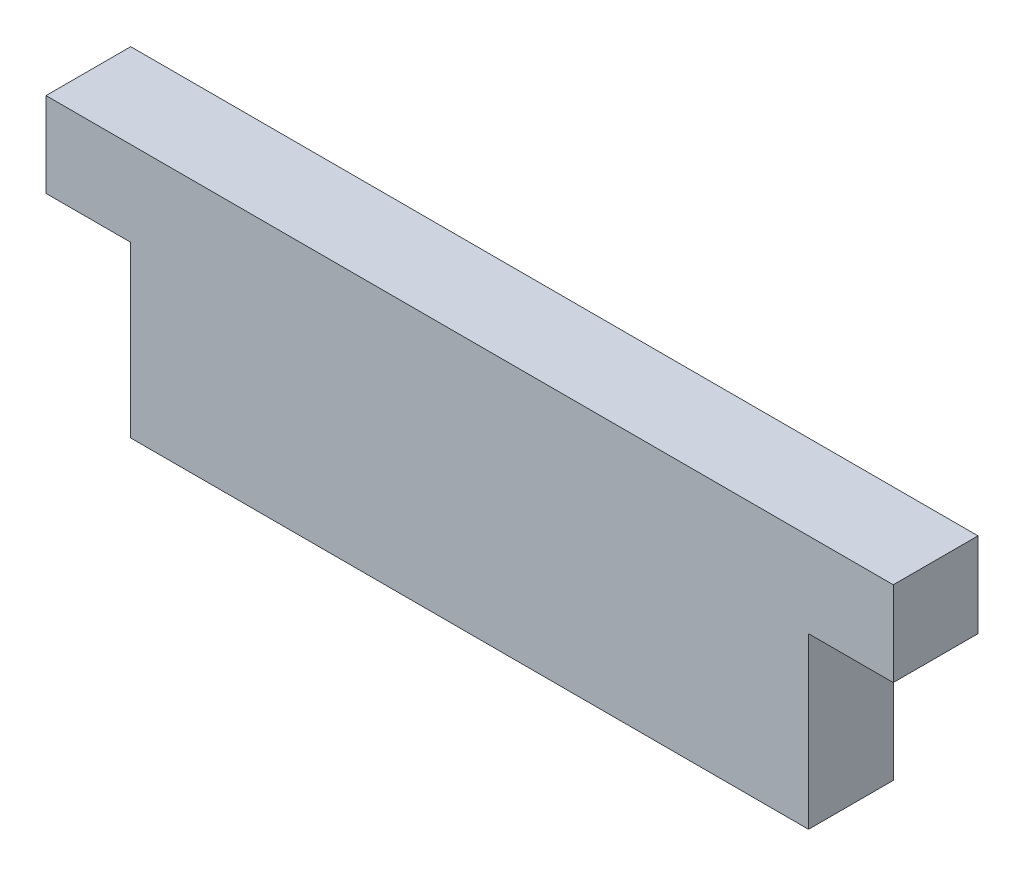
ISO-10303-21;
HEADER;
FILE_DESCRIPTION(('STEP AP214'),'2;1');
FILE_NAME('part.step','',(''),(''),'','','');
FILE_SCHEMA(('AUTOMOTIVE_DESIGN { 1 0 10303 214 1 1 1 1 }'));
ENDSEC;
DATA;
#1=APPLICATION_CONTEXT('core data for automotive mechanical design processes');
#2=APPLICATION_PROTOCOL_DEFINITION('international standard','automotive_design',2000,#1);
#3=PRODUCT_CONTEXT('',#1,'mechanical');
#4=PRODUCT('Part','Part','',(#3));
#5=PRODUCT_RELATED_PRODUCT_CATEGORY('part','',(#4));
#6=PRODUCT_DEFINITION_FORMATION('','',#4);
#7=PRODUCT_DEFINITION_CONTEXT('part definition',#1,'design');
#8=PRODUCT_DEFINITION('design','',#6,#7);
#9=PRODUCT_DEFINITION_SHAPE('','',#8);
#10=(LENGTH_UNIT() NAMED_UNIT(*) SI_UNIT(.MILLI.,.METRE.));
#11=(NAMED_UNIT(*) PLANE_ANGLE_UNIT() SI_UNIT($,.RADIAN.));
#12=(NAMED_UNIT(*) SI_UNIT($,.STERADIAN.) SOLID_ANGLE_UNIT());
#13=UNCERTAINTY_MEASURE_WITH_UNIT(LENGTH_MEASURE(1.E-05),#10,'distance_accuracy_value','');
#14=(GEOMETRIC_REPRESENTATION_CONTEXT(3) GLOBAL_UNCERTAINTY_ASSIGNED_CONTEXT((#13)) GLOBAL_UNIT_ASSIGNED_CONTEXT((#10,
#11,#12)) REPRESENTATION_CONTEXT('',''));
#15=CARTESIAN_POINT('',(0.,0.,0.));
#16=DIRECTION('',(0.,0.,1.));
#17=DIRECTION('',(1.,0.,0.));
#18=AXIS2_PLACEMENT_3D('',#15,#16,#17);
#19=CARTESIAN_POINT('',(0.,0.,5.));
#20=DIRECTION('',(1.,0.,0.));
#21=DIRECTION('',(0.,1.,0.));
#22=AXIS2_PLACEMENT_3D('',#19,#20,#21);
#23=PLANE('',#22);
#24=DIRECTION('',(0.,-1.,0.));
#25=VECTOR('',#24,1.);
#26=CARTESIAN_POINT('',(0.,0.,0.));
#27=LINE('',#26,#25);
#28=CARTESIAN_POINT('',(0.,0.,0.));
#29=VERTEX_POINT('',#28);
#30=CARTESIAN_POINT('',(0.,-10.,0.));
#31=VERTEX_POINT('',#30);
#32=EDGE_CURVE('E128',#29,#31,#27,.T.);
#33=ORIENTED_EDGE('',*,*,#32,.F.);
#34=DIRECTION('',(0.,0.,-1.));
#35=VECTOR('',#34,1.);
#36=CARTESIAN_POINT('',(0.,0.,5.));
#37=LINE('',#36,#35);
#38=CARTESIAN_POINT('',(0.,0.,5.));
#39=VERTEX_POINT('',#38);
#40=EDGE_CURVE('E11',#39,#29,#37,.T.);
#41=ORIENTED_EDGE('',*,*,#40,.F.);
#42=DIRECTION('',(0.,-1.,0.));
#43=VECTOR('',#42,1.);
#44=CARTESIAN_POINT('',(0.,0.,5.));
#45=LINE('',#44,#43);
#46=CARTESIAN_POINT('',(0.,-10.,5.));
#47=VERTEX_POINT('',#46);
#48=EDGE_CURVE('E146',#39,#47,#45,.T.);
#49=ORIENTED_EDGE('',*,*,#48,.T.);
#50=DIRECTION('',(0.,0.,-1.));
#51=VECTOR('',#50,1.);
#52=CARTESIAN_POINT('',(0.,-10.,5.));
#53=LINE('',#52,#51);
#54=EDGE_CURVE('E48',#47,#31,#53,.T.);
#55=ORIENTED_EDGE('',*,*,#54,.T.);
#56=EDGE_LOOP('',(#33,#41,#49,#55));
#57=FACE_BOUND('',#56,.T.);
#58=ADVANCED_FACE('F32',(#57),#23,.T.);
#59=CARTESIAN_POINT('',(0.,0.,5.));
#60=DIRECTION('',(0.,1.,0.));
#61=DIRECTION('',(0.,0.,1.));
#62=AXIS2_PLACEMENT_3D('',#59,#60,#61);
#63=PLANE('',#62);
#64=DIRECTION('',(1.,0.,0.));
#65=VECTOR('',#64,1.);
#66=CARTESIAN_POINT('',(0.,0.,0.));
#67=LINE('',#66,#65);
#68=CARTESIAN_POINT('',(5.,0.,0.));
#69=VERTEX_POINT('',#68);
#70=EDGE_CURVE('E130',#29,#69,#67,.T.);
#71=ORIENTED_EDGE('',*,*,#70,.T.);
#72=DIRECTION('',(0.,0.,-1.));
#73=VECTOR('',#72,1.);
#74=CARTESIAN_POINT('',(5.,0.,5.));
#75=LINE('',#74,#73);
#76=CARTESIAN_POINT('',(5.,0.,5.));
#77=VERTEX_POINT('',#76);
#78=EDGE_CURVE('E40',#77,#69,#75,.T.);
#79=ORIENTED_EDGE('',*,*,#78,.F.);
#80=DIRECTION('',(1.,0.,0.));
#81=VECTOR('',#80,1.);
#82=CARTESIAN_POINT('',(0.,0.,5.));
#83=LINE('',#82,#81);
#84=EDGE_CURVE('E111',#39,#77,#83,.T.);
#85=ORIENTED_EDGE('',*,*,#84,.F.);
#86=ORIENTED_EDGE('',*,*,#40,.T.);
#87=EDGE_LOOP('',(#71,#79,#85,#86));
#88=FACE_BOUND('',#87,.T.);
#89=ADVANCED_FACE('F184',(#88),#63,.F.);
#90=CARTESIAN_POINT('',(5.,0.,5.));
#91=DIRECTION('',(-1.,0.,0.));
#92=DIRECTION('',(0.,-1.,0.));
#93=AXIS2_PLACEMENT_3D('',#90,#91,#92);
#94=PLANE('',#93);
#95=DIRECTION('',(0.,1.,0.));
#96=VECTOR('',#95,1.);
#97=CARTESIAN_POINT('',(5.,0.,0.));
#98=LINE('',#97,#96);
#99=CARTESIAN_POINT('',(5.,4.99999999999999,0.));
#100=VERTEX_POINT('',#99);
#101=EDGE_CURVE('E132',#69,#100,#98,.T.);
#102=ORIENTED_EDGE('',*,*,#101,.T.);
#103=DIRECTION('',(0.,0.,-1.));
#104=VECTOR('',#103,1.);
#105=CARTESIAN_POINT('',(5.,4.99999999999999,5.));
#106=LINE('',#105,#104);
#107=CARTESIAN_POINT('',(5.,4.99999999999999,5.));
#108=VERTEX_POINT('',#107);
#109=EDGE_CURVE('E152',#108,#100,#106,.T.);
#110=ORIENTED_EDGE('',*,*,#109,.F.);
#111=DIRECTION('',(0.,1.,0.));
#112=VECTOR('',#111,1.);
#113=CARTESIAN_POINT('',(5.,0.,5.));
#114=LINE('',#113,#112);
#115=EDGE_CURVE('E160',#77,#108,#114,.T.);
#116=ORIENTED_EDGE('',*,*,#115,.F.);
#117=ORIENTED_EDGE('',*,*,#78,.T.);
#118=EDGE_LOOP('',(#102,#110,#116,#117));
#119=FACE_BOUND('',#118,.T.);
#120=ADVANCED_FACE('F158',(#119),#94,.F.);
#121=CARTESIAN_POINT('',(0.,4.99999999999999,5.));
#122=DIRECTION('',(0.,1.,0.));
#123=DIRECTION('',(0.,0.,1.));
#124=AXIS2_PLACEMENT_3D('',#121,#122,#123);
#125=PLANE('',#124);
#126=DIRECTION('',(1.,0.,0.));
#127=VECTOR('',#126,1.);
#128=CARTESIAN_POINT('',(0.,4.99999999999999,0.));
#129=LINE('',#128,#127);
#130=CARTESIAN_POINT('',(-45.,4.99999999999999,0.));
#131=VERTEX_POINT('',#130);
#132=EDGE_CURVE('E135',#131,#100,#129,.T.);
#133=ORIENTED_EDGE('',*,*,#132,.F.);
#134=DIRECTION('',(0.,0.,-1.));
#135=VECTOR('',#134,1.);
#136=CARTESIAN_POINT('',(-45.,4.99999999999999,5.));
#137=LINE('',#136,#135);
#138=CARTESIAN_POINT('',(-45.,4.99999999999999,5.));
#139=VERTEX_POINT('',#138);
#140=EDGE_CURVE('E150',#139,#131,#137,.T.);
#141=ORIENTED_EDGE('',*,*,#140,.F.);
#142=DIRECTION('',(1.,0.,0.));
#143=VECTOR('',#142,1.);
#144=CARTESIAN_POINT('',(0.,4.99999999999999,5.));
#145=LINE('',#144,#143);
#146=EDGE_CURVE('E170',#139,#108,#145,.T.);
#147=ORIENTED_EDGE('',*,*,#146,.T.);
#148=ORIENTED_EDGE('',*,*,#109,.T.);
#149=EDGE_LOOP('',(#133,#141,#147,#148));
#150=FACE_BOUND('',#149,.T.);
#151=ADVANCED_FACE('F168',(#150),#125,.T.);
#152=CARTESIAN_POINT('',(-45.,0.,5.));
#153=DIRECTION('',(-1.,0.,0.));
#154=DIRECTION('',(0.,0.,1.));
#155=AXIS2_PLACEMENT_3D('',#152,#153,#154);
#156=PLANE('',#155);
#157=DIRECTION('',(0.,1.,0.));
#158=VECTOR('',#157,1.);
#159=CARTESIAN_POINT('',(-45.,0.,0.));
#160=LINE('',#159,#158);
#161=CARTESIAN_POINT('',(-45.,0.,0.));
#162=VERTEX_POINT('',#161);
#163=EDGE_CURVE('E138',#162,#131,#160,.T.);
#164=ORIENTED_EDGE('',*,*,#163,.F.);
#165=DIRECTION('',(0.,0.,-1.));
#166=VECTOR('',#165,1.);
#167=CARTESIAN_POINT('',(-45.,0.,5.));
#168=LINE('',#167,#166);
#169=CARTESIAN_POINT('',(-45.,0.,5.));
#170=VERTEX_POINT('',#169);
#171=EDGE_CURVE('E119',#170,#162,#168,.T.);
#172=ORIENTED_EDGE('',*,*,#171,.F.);
#173=DIRECTION('',(0.,1.,0.));
#174=VECTOR('',#173,1.);
#175=CARTESIAN_POINT('',(-45.,0.,5.));
#176=LINE('',#175,#174);
#177=EDGE_CURVE('E108',#170,#139,#176,.T.);
#178=ORIENTED_EDGE('',*,*,#177,.T.);
#179=ORIENTED_EDGE('',*,*,#140,.T.);
#180=EDGE_LOOP('',(#164,#172,#178,#179));
#181=FACE_BOUND('',#180,.T.);
#182=ADVANCED_FACE('F194',(#181),#156,.T.);
#183=CARTESIAN_POINT('',(-40.,0.,0.));
#184=VERTEX_POINT('',#183);
#185=EDGE_CURVE('E116',#162,#184,#67,.T.);
#186=ORIENTED_EDGE('',*,*,#185,.T.);
#187=DIRECTION('',(0.,0.,-1.));
#188=VECTOR('',#187,1.);
#189=CARTESIAN_POINT('',(-40.,0.,5.));
#190=LINE('',#189,#188);
#191=CARTESIAN_POINT('',(-40.,0.,5.));
#192=VERTEX_POINT('',#191);
#193=EDGE_CURVE('E113',#192,#184,#190,.T.);
#194=ORIENTED_EDGE('',*,*,#193,.F.);
#195=EDGE_CURVE('E99',#170,#192,#83,.T.);
#196=ORIENTED_EDGE('',*,*,#195,.F.);
#197=ORIENTED_EDGE('',*,*,#171,.T.);
#198=EDGE_LOOP('',(#186,#194,#196,#197));
#199=FACE_BOUND('',#198,.T.);
#200=ADVANCED_FACE('F114',(#199),#63,.F.);
#201=CARTESIAN_POINT('',(-40.,0.,5.));
#202=DIRECTION('',(1.,0.,0.));
#203=DIRECTION('',(0.,0.,-1.));
#204=AXIS2_PLACEMENT_3D('',#201,#202,#203);
#205=PLANE('',#204);
#206=DIRECTION('',(0.,-1.,0.));
#207=VECTOR('',#206,1.);
#208=CARTESIAN_POINT('',(-40.,0.,0.));
#209=LINE('',#208,#207);
#210=CARTESIAN_POINT('',(-40.,-10.,0.));
#211=VERTEX_POINT('',#210);
#212=EDGE_CURVE('E141',#184,#211,#209,.T.);
#213=ORIENTED_EDGE('',*,*,#212,.T.);
#214=DIRECTION('',(0.,0.,-1.));
#215=VECTOR('',#214,1.);
#216=CARTESIAN_POINT('',(-40.,-10.,5.));
#217=LINE('',#216,#215);
#218=CARTESIAN_POINT('',(-40.,-10.,5.));
#219=VERTEX_POINT('',#218);
#220=EDGE_CURVE('E74',#219,#211,#217,.T.);
#221=ORIENTED_EDGE('',*,*,#220,.F.);
#222=DIRECTION('',(0.,-1.,0.));
#223=VECTOR('',#222,1.);
#224=CARTESIAN_POINT('',(-40.,0.,5.));
#225=LINE('',#224,#223);
#226=EDGE_CURVE('E105',#192,#219,#225,.T.);
#227=ORIENTED_EDGE('',*,*,#226,.F.);
#228=ORIENTED_EDGE('',*,*,#193,.T.);
#229=EDGE_LOOP('',(#213,#221,#227,#228));
#230=FACE_BOUND('',#229,.T.);
#231=ADVANCED_FACE('F121',(#230),#205,.F.);
#232=CARTESIAN_POINT('',(0.,-10.,5.));
#233=DIRECTION('',(0.,-1.,0.));
#234=DIRECTION('',(1.,0.,0.));
#235=AXIS2_PLACEMENT_3D('',#232,#233,#234);
#236=PLANE('',#235);
#237=DIRECTION('',(-1.,0.,0.));
#238=VECTOR('',#237,1.);
#239=CARTESIAN_POINT('',(0.,-10.,0.));
#240=LINE('',#239,#238);
#241=EDGE_CURVE('E143',#31,#211,#240,.T.);
#242=ORIENTED_EDGE('',*,*,#241,.F.);
#243=ORIENTED_EDGE('',*,*,#54,.F.);
#244=DIRECTION('',(-1.,0.,0.));
#245=VECTOR('',#244,1.);
#246=CARTESIAN_POINT('',(0.,-10.,5.));
#247=LINE('',#246,#245);
#248=EDGE_CURVE('E122',#47,#219,#247,.T.);
#249=ORIENTED_EDGE('',*,*,#248,.T.);
#250=ORIENTED_EDGE('',*,*,#220,.T.);
#251=EDGE_LOOP('',(#242,#243,#249,#250));
#252=FACE_BOUND('',#251,.T.);
#253=ADVANCED_FACE('F173',(#252),#236,.T.);
#254=CARTESIAN_POINT('',(0.,0.,5.));
#255=DIRECTION('',(0.,0.,1.));
#256=DIRECTION('',(1.,0.,0.));
#257=AXIS2_PLACEMENT_3D('',#254,#255,#256);
#258=PLANE('',#257);
#259=ORIENTED_EDGE('',*,*,#48,.F.);
#260=ORIENTED_EDGE('',*,*,#84,.T.);
#261=ORIENTED_EDGE('',*,*,#115,.T.);
#262=ORIENTED_EDGE('',*,*,#146,.F.);
#263=ORIENTED_EDGE('',*,*,#177,.F.);
#264=ORIENTED_EDGE('',*,*,#195,.T.);
#265=ORIENTED_EDGE('',*,*,#226,.T.);
#266=ORIENTED_EDGE('',*,*,#248,.F.);
#267=EDGE_LOOP('',(#259,#260,#261,#262,#263,#264,#265,#266));
#268=FACE_BOUND('',#267,.T.);
#269=ADVANCED_FACE('F102',(#268),#258,.T.);
#270=CARTESIAN_POINT('',(0.,0.,0.));
#271=DIRECTION('',(0.,0.,1.));
#272=DIRECTION('',(1.,0.,0.));
#273=AXIS2_PLACEMENT_3D('',#270,#271,#272);
#274=PLANE('',#273);
#275=ORIENTED_EDGE('',*,*,#32,.T.);
#276=ORIENTED_EDGE('',*,*,#241,.T.);
#277=ORIENTED_EDGE('',*,*,#212,.F.);
#278=ORIENTED_EDGE('',*,*,#185,.F.);
#279=ORIENTED_EDGE('',*,*,#163,.T.);
#280=ORIENTED_EDGE('',*,*,#132,.T.);
#281=ORIENTED_EDGE('',*,*,#101,.F.);
#282=ORIENTED_EDGE('',*,*,#70,.F.);
#283=EDGE_LOOP('',(#275,#276,#277,#278,#279,#280,#281,#282));
#284=FACE_BOUND('',#283,.T.);
#285=ADVANCED_FACE('F164',(#284),#274,.F.);
#286=CLOSED_SHELL('',(#58,#89,#120,#151,#182,#200,#231,#253,#269,#285));
#287=MANIFOLD_SOLID_BREP('B2',#286);
#288=ADVANCED_BREP_SHAPE_REPRESENTATION('',(#18,#287),#14);
#289=SHAPE_DEFINITION_REPRESENTATION(#9,#288);
ENDSEC;
END-ISO-10303-21;
